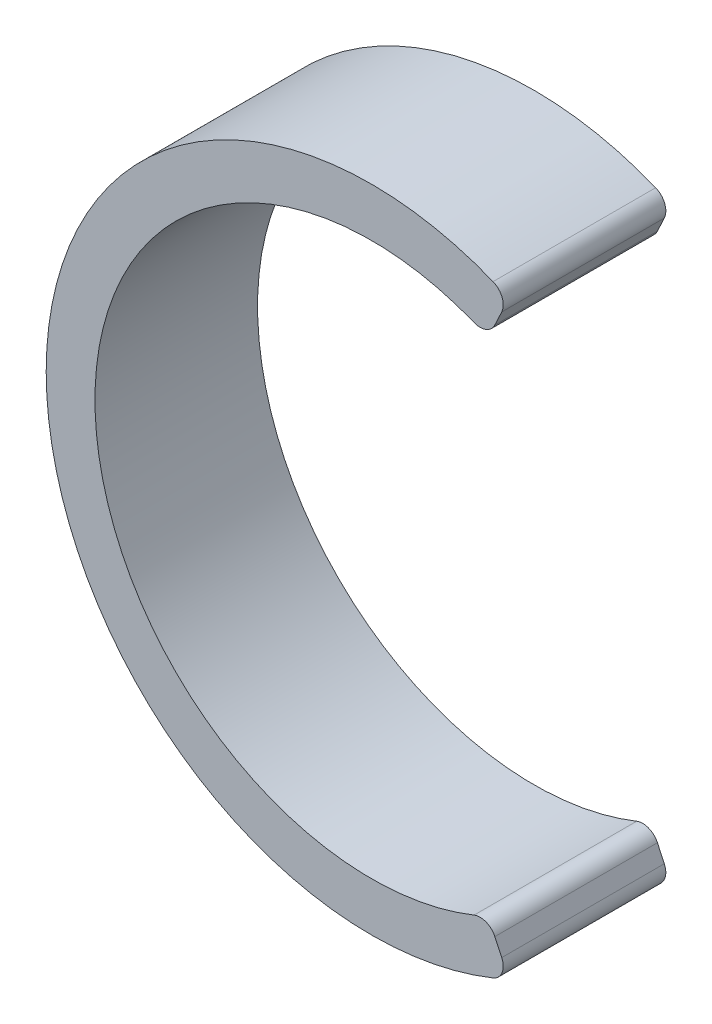
ISO-10303-21;
HEADER;
FILE_DESCRIPTION(('STEP AP214'),'2;1');
FILE_NAME('part.step','',(''),(''),'','','');
FILE_SCHEMA(('AUTOMOTIVE_DESIGN { 1 0 10303 214 1 1 1 1 }'));
ENDSEC;
DATA;
#1=APPLICATION_CONTEXT('core data for automotive mechanical design processes');
#2=APPLICATION_PROTOCOL_DEFINITION('international standard','automotive_design',2000,#1);
#3=PRODUCT_CONTEXT('',#1,'mechanical');
#4=PRODUCT('Part','Part','',(#3));
#5=PRODUCT_RELATED_PRODUCT_CATEGORY('part','',(#4));
#6=PRODUCT_DEFINITION_FORMATION('','',#4);
#7=PRODUCT_DEFINITION_CONTEXT('part definition',#1,'design');
#8=PRODUCT_DEFINITION('design','',#6,#7);
#9=PRODUCT_DEFINITION_SHAPE('','',#8);
#10=(LENGTH_UNIT() NAMED_UNIT(*) SI_UNIT(.MILLI.,.METRE.));
#11=(NAMED_UNIT(*) PLANE_ANGLE_UNIT() SI_UNIT($,.RADIAN.));
#12=(NAMED_UNIT(*) SI_UNIT($,.STERADIAN.) SOLID_ANGLE_UNIT());
#13=UNCERTAINTY_MEASURE_WITH_UNIT(LENGTH_MEASURE(1.E-05),#10,'distance_accuracy_value','');
#14=(GEOMETRIC_REPRESENTATION_CONTEXT(3) GLOBAL_UNCERTAINTY_ASSIGNED_CONTEXT((#13)) GLOBAL_UNIT_ASSIGNED_CONTEXT((#10,
#11,#12)) REPRESENTATION_CONTEXT('',''));
#15=CARTESIAN_POINT('',(0.,0.,0.));
#16=DIRECTION('',(0.,0.,1.));
#17=DIRECTION('',(1.,0.,0.));
#18=AXIS2_PLACEMENT_3D('',#15,#16,#17);
#19=CARTESIAN_POINT('',(7.1123099402542,17.6185994708365,10.));
#20=DIRECTION('',(0.,0.,-1.));
#21=DIRECTION('',(-1.,0.,0.));
#22=AXIS2_PLACEMENT_3D('',#19,#20,#21);
#23=CYLINDRICAL_SURFACE('',#22,1.);
#24=CARTESIAN_POINT('',(7.1123099402542,17.6185994708365,0.));
#25=DIRECTION('',(0.,0.,1.));
#26=DIRECTION('',(1.,0.,0.));
#27=AXIS2_PLACEMENT_3D('',#24,#25,#26);
#28=CIRCLE('',#27,1.);
#29=CARTESIAN_POINT('',(8.01861772729086,17.1959812090958,0.));
#30=VERTEX_POINT('',#29);
#31=CARTESIAN_POINT('',(7.48664204237285,18.5458941798279,0.));
#32=VERTEX_POINT('',#31);
#33=EDGE_CURVE('E129',#30,#32,#28,.T.);
#34=ORIENTED_EDGE('',*,*,#33,.T.);
#35=DIRECTION('',(0.,0.,-1.));
#36=VECTOR('',#35,1.);
#37=CARTESIAN_POINT('',(7.48664204237285,18.5458941798279,10.));
#38=LINE('',#37,#36);
#39=CARTESIAN_POINT('',(7.48664204237285,18.5458941798279,10.));
#40=VERTEX_POINT('',#39);
#41=EDGE_CURVE('E11',#40,#32,#38,.T.);
#42=ORIENTED_EDGE('',*,*,#41,.F.);
#43=CARTESIAN_POINT('',(7.1123099402542,17.6185994708365,10.));
#44=DIRECTION('',(0.,0.,1.));
#45=DIRECTION('',(1.,0.,0.));
#46=AXIS2_PLACEMENT_3D('',#43,#44,#45);
#47=CIRCLE('',#46,1.);
#48=CARTESIAN_POINT('',(8.01861772729086,17.1959812090958,10.));
#49=VERTEX_POINT('',#48);
#50=EDGE_CURVE('E143',#49,#40,#47,.T.);
#51=ORIENTED_EDGE('',*,*,#50,.F.);
#52=DIRECTION('',(0.,0.,-1.));
#53=VECTOR('',#52,1.);
#54=CARTESIAN_POINT('',(8.01861772729086,17.1959812090958,10.));
#55=LINE('',#54,#53);
#56=EDGE_CURVE('E125',#49,#30,#55,.T.);
#57=ORIENTED_EDGE('',*,*,#56,.T.);
#58=EDGE_LOOP('',(#34,#42,#51,#57));
#59=FACE_BOUND('',#58,.T.);
#60=ADVANCED_FACE('F33',(#59),#23,.T.);
#61=CARTESIAN_POINT('',(0.,0.,10.));
#62=DIRECTION('',(0.,0.,-1.));
#63=DIRECTION('',(-1.,0.,0.));
#64=AXIS2_PLACEMENT_3D('',#61,#62,#63);
#65=CYLINDRICAL_SURFACE('',#64,20.);
#66=CARTESIAN_POINT('',(0.,0.,0.));
#67=DIRECTION('',(0.,0.,1.));
#68=DIRECTION('',(1.,0.,0.));
#69=AXIS2_PLACEMENT_3D('',#66,#67,#68);
#70=CIRCLE('',#69,20.);
#71=CARTESIAN_POINT('',(7.48664204237272,-18.545894179828,0.));
#72=VERTEX_POINT('',#71);
#73=EDGE_CURVE('E132',#32,#72,#70,.T.);
#74=ORIENTED_EDGE('',*,*,#73,.T.);
#75=DIRECTION('',(0.,0.,-1.));
#76=VECTOR('',#75,1.);
#77=CARTESIAN_POINT('',(7.48664204237272,-18.545894179828,10.));
#78=LINE('',#77,#76);
#79=CARTESIAN_POINT('',(7.48664204237272,-18.545894179828,10.));
#80=VERTEX_POINT('',#79);
#81=EDGE_CURVE('E41',#80,#72,#78,.T.);
#82=ORIENTED_EDGE('',*,*,#81,.F.);
#83=CARTESIAN_POINT('',(0.,0.,10.));
#84=DIRECTION('',(0.,0.,1.));
#85=DIRECTION('',(1.,0.,0.));
#86=AXIS2_PLACEMENT_3D('',#83,#84,#85);
#87=CIRCLE('',#86,20.);
#88=EDGE_CURVE('E92',#40,#80,#87,.T.);
#89=ORIENTED_EDGE('',*,*,#88,.F.);
#90=ORIENTED_EDGE('',*,*,#41,.T.);
#91=EDGE_LOOP('',(#74,#82,#89,#90));
#92=FACE_BOUND('',#91,.T.);
#93=ADVANCED_FACE('F178',(#92),#65,.T.);
#94=CARTESIAN_POINT('',(7.11230994025408,-17.6185994708366,10.));
#95=DIRECTION('',(0.,0.,-1.));
#96=DIRECTION('',(-1.,0.,0.));
#97=AXIS2_PLACEMENT_3D('',#94,#95,#96);
#98=CYLINDRICAL_SURFACE('',#97,0.999999999999996);
#99=CARTESIAN_POINT('',(7.11230994025408,-17.6185994708366,0.));
#100=DIRECTION('',(0.,0.,1.));
#101=DIRECTION('',(-1.,0.,0.));
#102=AXIS2_PLACEMENT_3D('',#99,#100,#101);
#103=CIRCLE('',#102,0.999999999999996);
#104=CARTESIAN_POINT('',(8.01861772729073,-17.1959812090959,0.));
#105=VERTEX_POINT('',#104);
#106=EDGE_CURVE('E134',#72,#105,#103,.T.);
#107=ORIENTED_EDGE('',*,*,#106,.T.);
#108=DIRECTION('',(0.,0.,-1.));
#109=VECTOR('',#108,1.);
#110=CARTESIAN_POINT('',(8.01861772729073,-17.1959812090959,10.));
#111=LINE('',#110,#109);
#112=CARTESIAN_POINT('',(8.01861772729073,-17.1959812090959,10.));
#113=VERTEX_POINT('',#112);
#114=EDGE_CURVE('E150',#113,#105,#111,.T.);
#115=ORIENTED_EDGE('',*,*,#114,.F.);
#116=CARTESIAN_POINT('',(7.11230994025408,-17.6185994708366,10.));
#117=DIRECTION('',(0.,0.,1.));
#118=DIRECTION('',(-1.,0.,0.));
#119=AXIS2_PLACEMENT_3D('',#116,#117,#118);
#120=CIRCLE('',#119,0.999999999999996);
#121=EDGE_CURVE('E158',#80,#113,#120,.T.);
#122=ORIENTED_EDGE('',*,*,#121,.F.);
#123=ORIENTED_EDGE('',*,*,#81,.T.);
#124=EDGE_LOOP('',(#107,#115,#122,#123));
#125=FACE_BOUND('',#124,.T.);
#126=ADVANCED_FACE('F156',(#125),#98,.T.);
#127=CARTESIAN_POINT('',(7.59538024299129,-16.2883454949967,10.));
#128=DIRECTION('',(-0.906307787036654,-0.42261826174069,0.));
#129=DIRECTION('',(0.42261826174069,-0.906307787036655,0.));
#130=AXIS2_PLACEMENT_3D('',#127,#128,#129);
#131=PLANE('',#130);
#132=DIRECTION('',(-0.42261826174069,0.906307787036654,0.));
#133=VECTOR('',#132,1.);
#134=CARTESIAN_POINT('',(7.59538024299129,-16.2883454949967,0.));
#135=LINE('',#134,#133);
#136=CARTESIAN_POINT('',(7.59538024299129,-16.2883454949967,0.));
#137=VERTEX_POINT('',#136);
#138=EDGE_CURVE('E136',#105,#137,#135,.T.);
#139=ORIENTED_EDGE('',*,*,#138,.T.);
#140=DIRECTION('',(0.,0.,-1.));
#141=VECTOR('',#140,1.);
#142=CARTESIAN_POINT('',(7.59538024299129,-16.2883454949967,10.));
#143=LINE('',#142,#141);
#144=CARTESIAN_POINT('',(7.59538024299129,-16.2883454949967,10.));
#145=VERTEX_POINT('',#144);
#146=EDGE_CURVE('E147',#145,#137,#143,.T.);
#147=ORIENTED_EDGE('',*,*,#146,.F.);
#148=DIRECTION('',(-0.42261826174069,0.906307787036654,0.));
#149=VECTOR('',#148,1.);
#150=CARTESIAN_POINT('',(7.59538024299129,-16.2883454949967,10.));
#151=LINE('',#150,#149);
#152=EDGE_CURVE('E170',#113,#145,#151,.T.);
#153=ORIENTED_EDGE('',*,*,#152,.F.);
#154=ORIENTED_EDGE('',*,*,#114,.T.);
#155=EDGE_LOOP('',(#139,#147,#153,#154));
#156=FACE_BOUND('',#155,.T.);
#157=ADVANCED_FACE('F166',(#156),#131,.F.);
#158=CARTESIAN_POINT('',(6.68907245595464,-16.7109637567373,10.));
#159=DIRECTION('',(0.,0.,-1.));
#160=DIRECTION('',(-1.,0.,0.));
#161=AXIS2_PLACEMENT_3D('',#158,#159,#160);
#162=CYLINDRICAL_SURFACE('',#161,1.00000000000001);
#163=CARTESIAN_POINT('',(6.68907245595464,-16.7109637567373,0.));
#164=DIRECTION('',(0.,0.,1.));
#165=DIRECTION('',(1.,0.,0.));
#166=AXIS2_PLACEMENT_3D('',#163,#164,#165);
#167=CIRCLE('',#166,1.00000000000001);
#168=CARTESIAN_POINT('',(6.3174573195127,-15.782576881363,0.));
#169=VERTEX_POINT('',#168);
#170=EDGE_CURVE('E138',#137,#169,#167,.T.);
#171=ORIENTED_EDGE('',*,*,#170,.T.);
#172=DIRECTION('',(0.,0.,-1.));
#173=VECTOR('',#172,1.);
#174=CARTESIAN_POINT('',(6.3174573195127,-15.782576881363,10.));
#175=LINE('',#174,#173);
#176=CARTESIAN_POINT('',(6.3174573195127,-15.782576881363,10.));
#177=VERTEX_POINT('',#176);
#178=EDGE_CURVE('E120',#177,#169,#175,.T.);
#179=ORIENTED_EDGE('',*,*,#178,.F.);
#180=CARTESIAN_POINT('',(6.68907245595464,-16.7109637567373,10.));
#181=DIRECTION('',(0.,0.,1.));
#182=DIRECTION('',(1.,0.,0.));
#183=AXIS2_PLACEMENT_3D('',#180,#181,#182);
#184=CIRCLE('',#183,1.00000000000001);
#185=EDGE_CURVE('E111',#145,#177,#184,.T.);
#186=ORIENTED_EDGE('',*,*,#185,.F.);
#187=ORIENTED_EDGE('',*,*,#146,.T.);
#188=EDGE_LOOP('',(#171,#179,#186,#187));
#189=FACE_BOUND('',#188,.T.);
#190=ADVANCED_FACE('F169',(#189),#162,.T.);
#191=CARTESIAN_POINT('',(0.,0.,10.));
#192=DIRECTION('',(0.,0.,-1.));
#193=DIRECTION('',(-1.,0.,0.));
#194=AXIS2_PLACEMENT_3D('',#191,#192,#193);
#195=CYLINDRICAL_SURFACE('',#194,17.);
#196=CARTESIAN_POINT('',(0.,0.,0.));
#197=DIRECTION('',(0.,0.,-1.));
#198=DIRECTION('',(1.,0.,0.));
#199=AXIS2_PLACEMENT_3D('',#196,#197,#198);
#200=CIRCLE('',#199,17.);
#201=CARTESIAN_POINT('',(6.31745731951282,15.782576881363,0.));
#202=VERTEX_POINT('',#201);
#203=EDGE_CURVE('E119',#169,#202,#200,.T.);
#204=ORIENTED_EDGE('',*,*,#203,.T.);
#205=DIRECTION('',(0.,0.,-1.));
#206=VECTOR('',#205,1.);
#207=CARTESIAN_POINT('',(6.31745731951282,15.782576881363,10.));
#208=LINE('',#207,#206);
#209=CARTESIAN_POINT('',(6.31745731951282,15.782576881363,10.));
#210=VERTEX_POINT('',#209);
#211=EDGE_CURVE('E116',#210,#202,#208,.T.);
#212=ORIENTED_EDGE('',*,*,#211,.F.);
#213=CARTESIAN_POINT('',(0.,0.,10.));
#214=DIRECTION('',(0.,0.,-1.));
#215=DIRECTION('',(1.,0.,0.));
#216=AXIS2_PLACEMENT_3D('',#213,#214,#215);
#217=CIRCLE('',#216,17.);
#218=EDGE_CURVE('E105',#177,#210,#217,.T.);
#219=ORIENTED_EDGE('',*,*,#218,.F.);
#220=ORIENTED_EDGE('',*,*,#178,.T.);
#221=EDGE_LOOP('',(#204,#212,#219,#220));
#222=FACE_BOUND('',#221,.T.);
#223=ADVANCED_FACE('F117',(#222),#195,.F.);
#224=CARTESIAN_POINT('',(6.68907245595476,16.7109637567373,10.));
#225=DIRECTION('',(0.,0.,-1.));
#226=DIRECTION('',(-1.,0.,0.));
#227=AXIS2_PLACEMENT_3D('',#224,#225,#226);
#228=CYLINDRICAL_SURFACE('',#227,1.00000000000001);
#229=CARTESIAN_POINT('',(6.68907245595476,16.7109637567373,0.));
#230=DIRECTION('',(0.,0.,1.));
#231=DIRECTION('',(-1.,0.,0.));
#232=AXIS2_PLACEMENT_3D('',#229,#230,#231);
#233=CIRCLE('',#232,1.00000000000001);
#234=CARTESIAN_POINT('',(7.5953802429914,16.2883454949966,0.));
#235=VERTEX_POINT('',#234);
#236=EDGE_CURVE('E78',#202,#235,#233,.T.);
#237=ORIENTED_EDGE('',*,*,#236,.T.);
#238=DIRECTION('',(0.,0.,-1.));
#239=VECTOR('',#238,1.);
#240=CARTESIAN_POINT('',(7.5953802429914,16.2883454949966,10.));
#241=LINE('',#240,#239);
#242=CARTESIAN_POINT('',(7.5953802429914,16.2883454949966,10.));
#243=VERTEX_POINT('',#242);
#244=EDGE_CURVE('E121',#243,#235,#241,.T.);
#245=ORIENTED_EDGE('',*,*,#244,.F.);
#246=CARTESIAN_POINT('',(6.68907245595476,16.7109637567373,10.));
#247=DIRECTION('',(0.,0.,1.));
#248=DIRECTION('',(-1.,0.,0.));
#249=AXIS2_PLACEMENT_3D('',#246,#247,#248);
#250=CIRCLE('',#249,1.00000000000001);
#251=EDGE_CURVE('E109',#210,#243,#250,.T.);
#252=ORIENTED_EDGE('',*,*,#251,.F.);
#253=ORIENTED_EDGE('',*,*,#211,.T.);
#254=EDGE_LOOP('',(#237,#245,#252,#253));
#255=FACE_BOUND('',#254,.T.);
#256=ADVANCED_FACE('F123',(#255),#228,.T.);
#257=CARTESIAN_POINT('',(7.5953802429914,16.2883454949966,10.));
#258=DIRECTION('',(-0.90630778703665,0.4226182617407,0.));
#259=DIRECTION('',(-0.4226182617407,-0.90630778703665,0.));
#260=AXIS2_PLACEMENT_3D('',#257,#258,#259);
#261=PLANE('',#260);
#262=DIRECTION('',(0.4226182617407,0.90630778703665,0.));
#263=VECTOR('',#262,1.);
#264=CARTESIAN_POINT('',(7.5953802429914,16.2883454949966,0.));
#265=LINE('',#264,#263);
#266=EDGE_CURVE('E84',#235,#30,#265,.T.);
#267=ORIENTED_EDGE('',*,*,#266,.T.);
#268=ORIENTED_EDGE('',*,*,#56,.F.);
#269=DIRECTION('',(0.4226182617407,0.90630778703665,0.));
#270=VECTOR('',#269,1.);
#271=CARTESIAN_POINT('',(7.5953802429914,16.2883454949966,10.));
#272=LINE('',#271,#270);
#273=EDGE_CURVE('E49',#243,#49,#272,.T.);
#274=ORIENTED_EDGE('',*,*,#273,.F.);
#275=ORIENTED_EDGE('',*,*,#244,.T.);
#276=EDGE_LOOP('',(#267,#268,#274,#275));
#277=FACE_BOUND('',#276,.T.);
#278=ADVANCED_FACE('F194',(#277),#261,.F.);
#279=CARTESIAN_POINT('',(7.1123099402542,17.6185994708365,10.));
#280=DIRECTION('',(0.,0.,1.));
#281=DIRECTION('',(1.,0.,0.));
#282=AXIS2_PLACEMENT_3D('',#279,#280,#281);
#283=PLANE('',#282);
#284=ORIENTED_EDGE('',*,*,#50,.T.);
#285=ORIENTED_EDGE('',*,*,#88,.T.);
#286=ORIENTED_EDGE('',*,*,#121,.T.);
#287=ORIENTED_EDGE('',*,*,#152,.T.);
#288=ORIENTED_EDGE('',*,*,#185,.T.);
#289=ORIENTED_EDGE('',*,*,#218,.T.);
#290=ORIENTED_EDGE('',*,*,#251,.T.);
#291=ORIENTED_EDGE('',*,*,#273,.T.);
#292=EDGE_LOOP('',(#284,#285,#286,#287,#288,#289,#290,#291));
#293=FACE_BOUND('',#292,.T.);
#294=ADVANCED_FACE('F107',(#293),#283,.T.);
#295=CARTESIAN_POINT('',(7.1123099402542,17.6185994708365,0.));
#296=DIRECTION('',(0.,0.,1.));
#297=DIRECTION('',(1.,0.,0.));
#298=AXIS2_PLACEMENT_3D('',#295,#296,#297);
#299=PLANE('',#298);
#300=ORIENTED_EDGE('',*,*,#33,.F.);
#301=ORIENTED_EDGE('',*,*,#266,.F.);
#302=ORIENTED_EDGE('',*,*,#236,.F.);
#303=ORIENTED_EDGE('',*,*,#203,.F.);
#304=ORIENTED_EDGE('',*,*,#170,.F.);
#305=ORIENTED_EDGE('',*,*,#138,.F.);
#306=ORIENTED_EDGE('',*,*,#106,.F.);
#307=ORIENTED_EDGE('',*,*,#73,.F.);
#308=EDGE_LOOP('',(#300,#301,#302,#303,#304,#305,#306,#307));
#309=FACE_BOUND('',#308,.T.);
#310=ADVANCED_FACE('F162',(#309),#299,.F.);
#311=CLOSED_SHELL('',(#60,#93,#126,#157,#190,#223,#256,#278,#294,#310));
#312=MANIFOLD_SOLID_BREP('B2',#311);
#313=ADVANCED_BREP_SHAPE_REPRESENTATION('',(#18,#312),#14);
#314=SHAPE_DEFINITION_REPRESENTATION(#9,#313);
ENDSEC;
END-ISO-10303-21;
